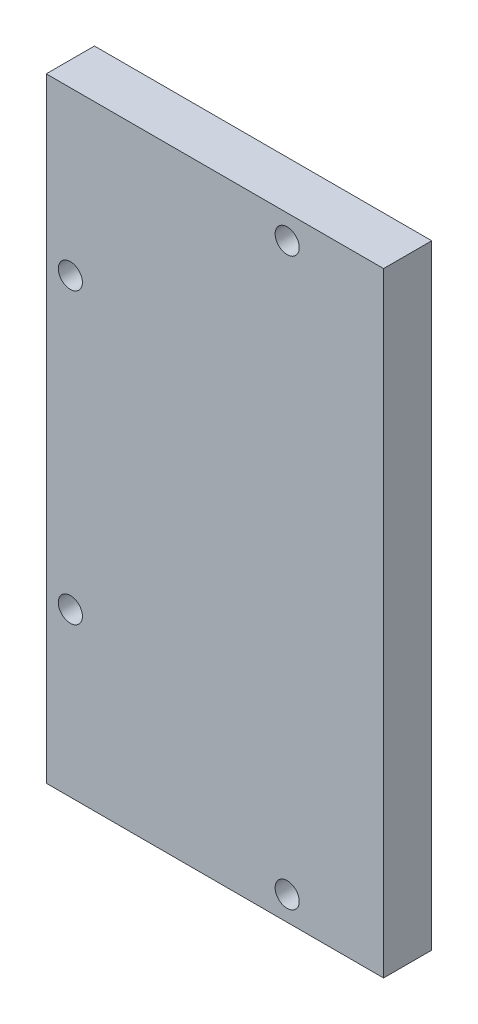
ISO-10303-21;
HEADER;
FILE_DESCRIPTION(('STEP AP214'),'2;1');
FILE_NAME('part.step','',(''),(''),'','','');
FILE_SCHEMA(('AUTOMOTIVE_DESIGN { 1 0 10303 214 1 1 1 1 }'));
ENDSEC;
DATA;
#1=APPLICATION_CONTEXT('core data for automotive mechanical design processes');
#2=APPLICATION_PROTOCOL_DEFINITION('international standard','automotive_design',2000,#1);
#3=PRODUCT_CONTEXT('',#1,'mechanical');
#4=PRODUCT('Part','Part','',(#3));
#5=PRODUCT_RELATED_PRODUCT_CATEGORY('part','',(#4));
#6=PRODUCT_DEFINITION_FORMATION('','',#4);
#7=PRODUCT_DEFINITION_CONTEXT('part definition',#1,'design');
#8=PRODUCT_DEFINITION('design','',#6,#7);
#9=PRODUCT_DEFINITION_SHAPE('','',#8);
#10=(LENGTH_UNIT() NAMED_UNIT(*) SI_UNIT(.MILLI.,.METRE.));
#11=(NAMED_UNIT(*) PLANE_ANGLE_UNIT() SI_UNIT($,.RADIAN.));
#12=(NAMED_UNIT(*) SI_UNIT($,.STERADIAN.) SOLID_ANGLE_UNIT());
#13=UNCERTAINTY_MEASURE_WITH_UNIT(LENGTH_MEASURE(1.E-05),#10,'distance_accuracy_value','');
#14=(GEOMETRIC_REPRESENTATION_CONTEXT(3) GLOBAL_UNCERTAINTY_ASSIGNED_CONTEXT((#13)) GLOBAL_UNIT_ASSIGNED_CONTEXT((#10,
#11,#12)) REPRESENTATION_CONTEXT('',''));
#15=CARTESIAN_POINT('',(0.,0.,0.));
#16=DIRECTION('',(0.,0.,1.));
#17=DIRECTION('',(1.,0.,0.));
#18=AXIS2_PLACEMENT_3D('',#15,#16,#17);
#19=CARTESIAN_POINT('',(0.,0.,12.7));
#20=DIRECTION('',(0.,0.,-1.));
#21=DIRECTION('',(-1.,0.,0.));
#22=AXIS2_PLACEMENT_3D('',#19,#20,#21);
#23=PLANE('',#22);
#24=CARTESIAN_POINT('',(6.35000000000001,-17.4625000000001,12.7));
#25=DIRECTION('',(0.,0.,1.));
#26=DIRECTION('',(1.,0.,0.));
#27=AXIS2_PLACEMENT_3D('',#24,#25,#26);
#28=CIRCLE('',#27,3.175);
#29=CARTESIAN_POINT('',(9.52500000000001,-17.4625000000001,12.7));
#30=VERTEX_POINT('',#29);
#31=EDGE_CURVE('E158',#30,#30,#28,.T.);
#32=ORIENTED_EDGE('',*,*,#31,.F.);
#33=EDGE_LOOP('',(#32));
#34=FACE_BOUND('',#33,.T.);
#35=CARTESIAN_POINT('',(6.35000000000001,58.7374999999999,12.7));
#36=DIRECTION('',(0.,0.,1.));
#37=DIRECTION('',(1.,0.,0.));
#38=AXIS2_PLACEMENT_3D('',#35,#36,#37);
#39=CIRCLE('',#38,3.175);
#40=CARTESIAN_POINT('',(9.52500000000002,58.7374999999999,12.7));
#41=VERTEX_POINT('',#40);
#42=EDGE_CURVE('E150',#41,#41,#39,.F.);
#43=ORIENTED_EDGE('',*,*,#42,.T.);
#44=EDGE_LOOP('',(#43));
#45=FACE_BOUND('',#44,.T.);
#46=CARTESIAN_POINT('',(63.5,95.2499999999999,12.7));
#47=DIRECTION('',(0.,0.,1.));
#48=DIRECTION('',(1.,0.,0.));
#49=AXIS2_PLACEMENT_3D('',#46,#47,#48);
#50=CIRCLE('',#49,3.175);
#51=CARTESIAN_POINT('',(66.675,95.2499999999999,12.7));
#52=VERTEX_POINT('',#51);
#53=EDGE_CURVE('E142',#52,#52,#50,.F.);
#54=ORIENTED_EDGE('',*,*,#53,.T.);
#55=EDGE_LOOP('',(#54));
#56=FACE_BOUND('',#55,.T.);
#57=DIRECTION('',(0.,1.,0.));
#58=VECTOR('',#57,1.);
#59=CARTESIAN_POINT('',(88.9,101.6,12.7));
#60=LINE('',#59,#58);
#61=CARTESIAN_POINT('',(88.9,-60.325,12.7));
#62=VERTEX_POINT('',#61);
#63=CARTESIAN_POINT('',(88.9,101.6,12.7));
#64=VERTEX_POINT('',#63);
#65=EDGE_CURVE('E104',#62,#64,#60,.T.);
#66=ORIENTED_EDGE('',*,*,#65,.T.);
#67=DIRECTION('',(-1.,0.,0.));
#68=VECTOR('',#67,1.);
#69=CARTESIAN_POINT('',(88.9,101.6,12.7));
#70=LINE('',#69,#68);
#71=CARTESIAN_POINT('',(0.,101.6,12.7));
#72=VERTEX_POINT('',#71);
#73=EDGE_CURVE('E99',#64,#72,#70,.T.);
#74=ORIENTED_EDGE('',*,*,#73,.T.);
#75=DIRECTION('',(0.,-1.,0.));
#76=VECTOR('',#75,1.);
#77=CARTESIAN_POINT('',(0.,101.6,12.7));
#78=LINE('',#77,#76);
#79=CARTESIAN_POINT('',(0.,-60.325,12.7));
#80=VERTEX_POINT('',#79);
#81=EDGE_CURVE('E102',#72,#80,#78,.T.);
#82=ORIENTED_EDGE('',*,*,#81,.T.);
#83=DIRECTION('',(1.,0.,0.));
#84=VECTOR('',#83,1.);
#85=CARTESIAN_POINT('',(88.9,-60.325,12.7));
#86=LINE('',#85,#84);
#87=EDGE_CURVE('E67',#80,#62,#86,.T.);
#88=ORIENTED_EDGE('',*,*,#87,.T.);
#89=EDGE_LOOP('',(#66,#74,#82,#88));
#90=FACE_BOUND('',#89,.T.);
#91=CARTESIAN_POINT('',(63.5,-53.975,12.7));
#92=DIRECTION('',(0.,0.,1.));
#93=DIRECTION('',(1.,0.,0.));
#94=AXIS2_PLACEMENT_3D('',#91,#92,#93);
#95=CIRCLE('',#94,3.175);
#96=CARTESIAN_POINT('',(66.675,-53.975,12.7));
#97=VERTEX_POINT('',#96);
#98=EDGE_CURVE('E166',#97,#97,#95,.T.);
#99=ORIENTED_EDGE('',*,*,#98,.F.);
#100=EDGE_LOOP('',(#99));
#101=FACE_BOUND('',#100,.T.);
#102=ADVANCED_FACE('F49',(#34,#45,#56,#90,#101),#23,.F.);
#103=CARTESIAN_POINT('',(0.,0.,0.));
#104=DIRECTION('',(0.,0.,-1.));
#105=DIRECTION('',(-1.,0.,0.));
#106=AXIS2_PLACEMENT_3D('',#103,#104,#105);
#107=PLANE('',#106);
#108=CARTESIAN_POINT('',(6.35000000000001,58.7374999999999,0.));
#109=DIRECTION('',(0.,0.,1.));
#110=DIRECTION('',(1.,0.,0.));
#111=AXIS2_PLACEMENT_3D('',#108,#109,#110);
#112=CIRCLE('',#111,3.175);
#113=CARTESIAN_POINT('',(9.52500000000002,58.7374999999999,0.));
#114=VERTEX_POINT('',#113);
#115=EDGE_CURVE('E154',#114,#114,#112,.F.);
#116=ORIENTED_EDGE('',*,*,#115,.F.);
#117=EDGE_LOOP('',(#116));
#118=FACE_BOUND('',#117,.T.);
#119=CARTESIAN_POINT('',(63.5,95.2499999999999,0.));
#120=DIRECTION('',(0.,0.,1.));
#121=DIRECTION('',(1.,0.,0.));
#122=AXIS2_PLACEMENT_3D('',#119,#120,#121);
#123=CIRCLE('',#122,3.175);
#124=CARTESIAN_POINT('',(66.675,95.2499999999999,0.));
#125=VERTEX_POINT('',#124);
#126=EDGE_CURVE('E146',#125,#125,#123,.F.);
#127=ORIENTED_EDGE('',*,*,#126,.F.);
#128=EDGE_LOOP('',(#127));
#129=FACE_BOUND('',#128,.T.);
#130=DIRECTION('',(0.,1.,0.));
#131=VECTOR('',#130,1.);
#132=CARTESIAN_POINT('',(88.9,101.6,0.));
#133=LINE('',#132,#131);
#134=CARTESIAN_POINT('',(88.9,-60.325,0.));
#135=VERTEX_POINT('',#134);
#136=CARTESIAN_POINT('',(88.9,101.6,0.));
#137=VERTEX_POINT('',#136);
#138=EDGE_CURVE('E120',#135,#137,#133,.T.);
#139=ORIENTED_EDGE('',*,*,#138,.F.);
#140=DIRECTION('',(1.,0.,0.));
#141=VECTOR('',#140,1.);
#142=CARTESIAN_POINT('',(88.9,-60.325,0.));
#143=LINE('',#142,#141);
#144=CARTESIAN_POINT('',(0.,-60.325,0.));
#145=VERTEX_POINT('',#144);
#146=EDGE_CURVE('E91',#145,#135,#143,.T.);
#147=ORIENTED_EDGE('',*,*,#146,.F.);
#148=DIRECTION('',(0.,-1.,0.));
#149=VECTOR('',#148,1.);
#150=CARTESIAN_POINT('',(0.,101.6,0.));
#151=LINE('',#150,#149);
#152=CARTESIAN_POINT('',(0.,101.6,0.));
#153=VERTEX_POINT('',#152);
#154=EDGE_CURVE('E85',#153,#145,#151,.T.);
#155=ORIENTED_EDGE('',*,*,#154,.F.);
#156=DIRECTION('',(-1.,0.,0.));
#157=VECTOR('',#156,1.);
#158=CARTESIAN_POINT('',(88.9,101.6,0.));
#159=LINE('',#158,#157);
#160=EDGE_CURVE('E109',#137,#153,#159,.T.);
#161=ORIENTED_EDGE('',*,*,#160,.F.);
#162=EDGE_LOOP('',(#139,#147,#155,#161));
#163=FACE_BOUND('',#162,.T.);
#164=CARTESIAN_POINT('',(6.35000000000001,-17.4625000000001,0.));
#165=DIRECTION('',(0.,0.,1.));
#166=DIRECTION('',(1.,0.,0.));
#167=AXIS2_PLACEMENT_3D('',#164,#165,#166);
#168=CIRCLE('',#167,3.175);
#169=CARTESIAN_POINT('',(9.52500000000001,-17.4625000000001,0.));
#170=VERTEX_POINT('',#169);
#171=EDGE_CURVE('E162',#170,#170,#168,.T.);
#172=ORIENTED_EDGE('',*,*,#171,.T.);
#173=EDGE_LOOP('',(#172));
#174=FACE_BOUND('',#173,.T.);
#175=CARTESIAN_POINT('',(63.5,-53.975,0.));
#176=DIRECTION('',(0.,0.,1.));
#177=DIRECTION('',(1.,0.,0.));
#178=AXIS2_PLACEMENT_3D('',#175,#176,#177);
#179=CIRCLE('',#178,3.175);
#180=CARTESIAN_POINT('',(66.675,-53.975,0.));
#181=VERTEX_POINT('',#180);
#182=EDGE_CURVE('E124',#181,#181,#179,.T.);
#183=ORIENTED_EDGE('',*,*,#182,.T.);
#184=EDGE_LOOP('',(#183));
#185=FACE_BOUND('',#184,.T.);
#186=ADVANCED_FACE('F137',(#118,#129,#163,#174,#185),#107,.T.);
#187=CARTESIAN_POINT('',(88.9,101.6,12.7));
#188=DIRECTION('',(-1.,0.,0.));
#189=DIRECTION('',(0.,0.,1.));
#190=AXIS2_PLACEMENT_3D('',#187,#188,#189);
#191=PLANE('',#190);
#192=ORIENTED_EDGE('',*,*,#138,.T.);
#193=DIRECTION('',(0.,0.,-1.));
#194=VECTOR('',#193,1.);
#195=CARTESIAN_POINT('',(88.9,101.6,12.7));
#196=LINE('',#195,#194);
#197=EDGE_CURVE('E11',#64,#137,#196,.T.);
#198=ORIENTED_EDGE('',*,*,#197,.F.);
#199=ORIENTED_EDGE('',*,*,#65,.F.);
#200=DIRECTION('',(0.,0.,-1.));
#201=VECTOR('',#200,1.);
#202=CARTESIAN_POINT('',(88.9,-60.325,12.7));
#203=LINE('',#202,#201);
#204=EDGE_CURVE('E116',#62,#135,#203,.T.);
#205=ORIENTED_EDGE('',*,*,#204,.T.);
#206=EDGE_LOOP('',(#192,#198,#199,#205));
#207=FACE_BOUND('',#206,.T.);
#208=ADVANCED_FACE('F51',(#207),#191,.F.);
#209=CARTESIAN_POINT('',(88.9,101.6,12.7));
#210=DIRECTION('',(0.,-1.,0.));
#211=DIRECTION('',(0.,0.,-1.));
#212=AXIS2_PLACEMENT_3D('',#209,#210,#211);
#213=PLANE('',#212);
#214=ORIENTED_EDGE('',*,*,#160,.T.);
#215=DIRECTION('',(0.,0.,-1.));
#216=VECTOR('',#215,1.);
#217=CARTESIAN_POINT('',(0.,101.6,12.7));
#218=LINE('',#217,#216);
#219=EDGE_CURVE('E59',#72,#153,#218,.T.);
#220=ORIENTED_EDGE('',*,*,#219,.F.);
#221=ORIENTED_EDGE('',*,*,#73,.F.);
#222=ORIENTED_EDGE('',*,*,#197,.T.);
#223=EDGE_LOOP('',(#214,#220,#221,#222));
#224=FACE_BOUND('',#223,.T.);
#225=ADVANCED_FACE('F108',(#224),#213,.F.);
#226=CARTESIAN_POINT('',(0.,101.6,12.7));
#227=DIRECTION('',(1.,0.,0.));
#228=DIRECTION('',(0.,0.,-1.));
#229=AXIS2_PLACEMENT_3D('',#226,#227,#228);
#230=PLANE('',#229);
#231=ORIENTED_EDGE('',*,*,#154,.T.);
#232=DIRECTION('',(0.,0.,-1.));
#233=VECTOR('',#232,1.);
#234=CARTESIAN_POINT('',(0.,-60.325,12.7));
#235=LINE('',#234,#233);
#236=EDGE_CURVE('E111',#80,#145,#235,.T.);
#237=ORIENTED_EDGE('',*,*,#236,.F.);
#238=ORIENTED_EDGE('',*,*,#81,.F.);
#239=ORIENTED_EDGE('',*,*,#219,.T.);
#240=EDGE_LOOP('',(#231,#237,#238,#239));
#241=FACE_BOUND('',#240,.T.);
#242=ADVANCED_FACE('F112',(#241),#230,.F.);
#243=CARTESIAN_POINT('',(88.9,-60.325,12.7));
#244=DIRECTION('',(0.,1.,0.));
#245=DIRECTION('',(0.,0.,1.));
#246=AXIS2_PLACEMENT_3D('',#243,#244,#245);
#247=PLANE('',#246);
#248=ORIENTED_EDGE('',*,*,#146,.T.);
#249=ORIENTED_EDGE('',*,*,#204,.F.);
#250=ORIENTED_EDGE('',*,*,#87,.F.);
#251=ORIENTED_EDGE('',*,*,#236,.T.);
#252=EDGE_LOOP('',(#248,#249,#250,#251));
#253=FACE_BOUND('',#252,.T.);
#254=ADVANCED_FACE('F134',(#253),#247,.F.);
#255=CARTESIAN_POINT('',(63.5,95.2499999999999,0.));
#256=DIRECTION('',(0.,0.,1.));
#257=DIRECTION('',(1.,0.,0.));
#258=AXIS2_PLACEMENT_3D('',#255,#256,#257);
#259=CYLINDRICAL_SURFACE('',#258,3.175);
#260=ORIENTED_EDGE('',*,*,#126,.T.);
#261=EDGE_LOOP('',(#260));
#262=FACE_BOUND('',#261,.T.);
#263=ORIENTED_EDGE('',*,*,#53,.F.);
#264=EDGE_LOOP('',(#263));
#265=FACE_BOUND('',#264,.T.);
#266=ADVANCED_FACE('F192',(#262,#265),#259,.F.);
#267=CARTESIAN_POINT('',(6.35000000000001,58.7374999999999,0.));
#268=DIRECTION('',(0.,0.,1.));
#269=DIRECTION('',(1.,0.,0.));
#270=AXIS2_PLACEMENT_3D('',#267,#268,#269);
#271=CYLINDRICAL_SURFACE('',#270,3.175);
#272=ORIENTED_EDGE('',*,*,#115,.T.);
#273=EDGE_LOOP('',(#272));
#274=FACE_BOUND('',#273,.T.);
#275=ORIENTED_EDGE('',*,*,#42,.F.);
#276=EDGE_LOOP('',(#275));
#277=FACE_BOUND('',#276,.T.);
#278=ADVANCED_FACE('F235',(#274,#277),#271,.F.);
#279=CARTESIAN_POINT('',(6.35000000000001,-17.4625000000001,0.));
#280=DIRECTION('',(0.,0.,1.));
#281=DIRECTION('',(1.,0.,0.));
#282=AXIS2_PLACEMENT_3D('',#279,#280,#281);
#283=CYLINDRICAL_SURFACE('',#282,3.175);
#284=ORIENTED_EDGE('',*,*,#171,.F.);
#285=EDGE_LOOP('',(#284));
#286=FACE_BOUND('',#285,.T.);
#287=ORIENTED_EDGE('',*,*,#31,.T.);
#288=EDGE_LOOP('',(#287));
#289=FACE_BOUND('',#288,.T.);
#290=ADVANCED_FACE('F178',(#286,#289),#283,.F.);
#291=CARTESIAN_POINT('',(63.5,-53.975,0.));
#292=DIRECTION('',(0.,0.,1.));
#293=DIRECTION('',(1.,0.,0.));
#294=AXIS2_PLACEMENT_3D('',#291,#292,#293);
#295=CYLINDRICAL_SURFACE('',#294,3.175);
#296=ORIENTED_EDGE('',*,*,#182,.F.);
#297=EDGE_LOOP('',(#296));
#298=FACE_BOUND('',#297,.T.);
#299=ORIENTED_EDGE('',*,*,#98,.T.);
#300=EDGE_LOOP('',(#299));
#301=FACE_BOUND('',#300,.T.);
#302=ADVANCED_FACE('F175',(#298,#301),#295,.F.);
#303=CLOSED_SHELL('',(#102,#186,#208,#225,#242,#254,#266,#278,#290,#302));
#304=MANIFOLD_SOLID_BREP('B2',#303);
#305=ADVANCED_BREP_SHAPE_REPRESENTATION('',(#18,#304),#14);
#306=SHAPE_DEFINITION_REPRESENTATION(#9,#305);
ENDSEC;
END-ISO-10303-21;
